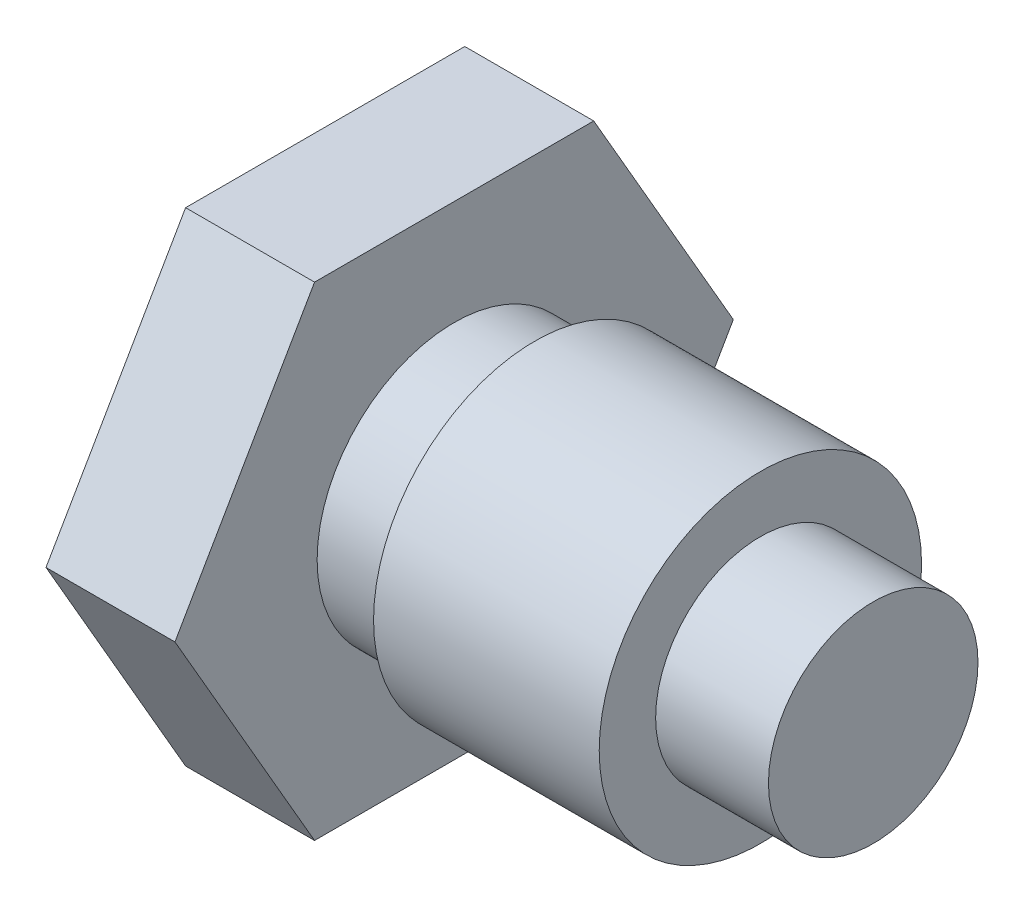
ISO-10303-21;
HEADER;
FILE_DESCRIPTION(('STEP AP214'),'2;1');
FILE_NAME('part.step','',(''),(''),'','','');
FILE_SCHEMA(('AUTOMOTIVE_DESIGN { 1 0 10303 214 1 1 1 1 }'));
ENDSEC;
DATA;
#1=APPLICATION_CONTEXT('core data for automotive mechanical design processes');
#2=APPLICATION_PROTOCOL_DEFINITION('international standard','automotive_design',2000,#1);
#3=PRODUCT_CONTEXT('',#1,'mechanical');
#4=PRODUCT('Part','Part','',(#3));
#5=PRODUCT_RELATED_PRODUCT_CATEGORY('part','',(#4));
#6=PRODUCT_DEFINITION_FORMATION('','',#4);
#7=PRODUCT_DEFINITION_CONTEXT('part definition',#1,'design');
#8=PRODUCT_DEFINITION('design','',#6,#7);
#9=PRODUCT_DEFINITION_SHAPE('','',#8);
#10=(LENGTH_UNIT() NAMED_UNIT(*) SI_UNIT(.MILLI.,.METRE.));
#11=(NAMED_UNIT(*) PLANE_ANGLE_UNIT() SI_UNIT($,.RADIAN.));
#12=(NAMED_UNIT(*) SI_UNIT($,.STERADIAN.) SOLID_ANGLE_UNIT());
#13=UNCERTAINTY_MEASURE_WITH_UNIT(LENGTH_MEASURE(1.E-05),#10,'distance_accuracy_value','');
#14=(GEOMETRIC_REPRESENTATION_CONTEXT(3) GLOBAL_UNCERTAINTY_ASSIGNED_CONTEXT((#13)) GLOBAL_UNIT_ASSIGNED_CONTEXT((#10,
#11,#12)) REPRESENTATION_CONTEXT('',''));
#15=CARTESIAN_POINT('',(0.,0.,0.));
#16=DIRECTION('',(0.,0.,1.));
#17=DIRECTION('',(1.,0.,0.));
#18=AXIS2_PLACEMENT_3D('',#15,#16,#17);
#19=CARTESIAN_POINT('',(8.,-14.9999930062483,-8.66025000000017));
#20=DIRECTION('',(0.,0.499999999999995,0.866025403784441));
#21=DIRECTION('',(0.,-0.866025403784442,0.499999999999995));
#22=AXIS2_PLACEMENT_3D('',#19,#20,#21);
#23=PLANE('',#22);
#24=DIRECTION('',(0.,0.866025403784441,-0.499999999999995));
#25=VECTOR('',#24,1.);
#26=CARTESIAN_POINT('',(0.,-14.9999930062483,-8.66025000000017));
#27=LINE('',#26,#25);
#28=CARTESIAN_POINT('',(0.,-14.9999930062483,-8.66025000000017));
#29=VERTEX_POINT('',#28);
#30=CARTESIAN_POINT('',(0.,0.,-17.3205));
#31=VERTEX_POINT('',#30);
#32=EDGE_CURVE('E123',#29,#31,#27,.T.);
#33=ORIENTED_EDGE('',*,*,#32,.T.);
#34=DIRECTION('',(-1.,0.,0.));
#35=VECTOR('',#34,1.);
#36=CARTESIAN_POINT('',(8.,0.,-17.3205));
#37=LINE('',#36,#35);
#38=CARTESIAN_POINT('',(8.,0.,-17.3205));
#39=VERTEX_POINT('',#38);
#40=EDGE_CURVE('E11',#39,#31,#37,.T.);
#41=ORIENTED_EDGE('',*,*,#40,.F.);
#42=DIRECTION('',(0.,0.866025403784441,-0.499999999999995));
#43=VECTOR('',#42,1.);
#44=CARTESIAN_POINT('',(8.,-14.9999930062483,-8.66025000000017));
#45=LINE('',#44,#43);
#46=CARTESIAN_POINT('',(8.,-14.9999930062483,-8.66025000000017));
#47=VERTEX_POINT('',#46);
#48=EDGE_CURVE('E134',#47,#39,#45,.T.);
#49=ORIENTED_EDGE('',*,*,#48,.F.);
#50=DIRECTION('',(-1.,0.,0.));
#51=VECTOR('',#50,1.);
#52=CARTESIAN_POINT('',(8.,-14.9999930062483,-8.66025000000017));
#53=LINE('',#52,#51);
#54=EDGE_CURVE('E119',#47,#29,#53,.T.);
#55=ORIENTED_EDGE('',*,*,#54,.T.);
#56=EDGE_LOOP('',(#33,#41,#49,#55));
#57=FACE_BOUND('',#56,.T.);
#58=ADVANCED_FACE('F39',(#57),#23,.F.);
#59=CARTESIAN_POINT('',(8.,0.,-17.3205));
#60=DIRECTION('',(0.,-0.500000000000001,0.866025403784438));
#61=DIRECTION('',(0.,-0.866025403784438,-0.500000000000001));
#62=AXIS2_PLACEMENT_3D('',#59,#60,#61);
#63=PLANE('',#62);
#64=DIRECTION('',(0.,0.866025403784438,0.500000000000001));
#65=VECTOR('',#64,1.);
#66=CARTESIAN_POINT('',(0.,0.,-17.3205));
#67=LINE('',#66,#65);
#68=CARTESIAN_POINT('',(0.,14.9999930062484,-8.66024999999996));
#69=VERTEX_POINT('',#68);
#70=EDGE_CURVE('E126',#31,#69,#67,.T.);
#71=ORIENTED_EDGE('',*,*,#70,.T.);
#72=DIRECTION('',(-1.,0.,0.));
#73=VECTOR('',#72,1.);
#74=CARTESIAN_POINT('',(8.,14.9999930062484,-8.66024999999996));
#75=LINE('',#74,#73);
#76=CARTESIAN_POINT('',(8.,14.9999930062484,-8.66024999999996));
#77=VERTEX_POINT('',#76);
#78=EDGE_CURVE('E47',#77,#69,#75,.T.);
#79=ORIENTED_EDGE('',*,*,#78,.F.);
#80=DIRECTION('',(0.,0.866025403784438,0.500000000000001));
#81=VECTOR('',#80,1.);
#82=CARTESIAN_POINT('',(8.,0.,-17.3205));
#83=LINE('',#82,#81);
#84=EDGE_CURVE('E92',#39,#77,#83,.T.);
#85=ORIENTED_EDGE('',*,*,#84,.F.);
#86=ORIENTED_EDGE('',*,*,#40,.T.);
#87=EDGE_LOOP('',(#71,#79,#85,#86));
#88=FACE_BOUND('',#87,.T.);
#89=ADVANCED_FACE('F159',(#88),#63,.F.);
#90=CARTESIAN_POINT('',(8.,14.9999930062484,-8.66024999999996));
#91=DIRECTION('',(0.,-1.,0.));
#92=DIRECTION('',(0.,0.,-1.));
#93=AXIS2_PLACEMENT_3D('',#90,#91,#92);
#94=PLANE('',#93);
#95=DIRECTION('',(0.,0.,1.));
#96=VECTOR('',#95,1.);
#97=CARTESIAN_POINT('',(0.,14.9999930062484,-8.66024999999996));
#98=LINE('',#97,#96);
#99=CARTESIAN_POINT('',(0.,14.9999930062483,8.66025000000007));
#100=VERTEX_POINT('',#99);
#101=EDGE_CURVE('E129',#69,#100,#98,.T.);
#102=ORIENTED_EDGE('',*,*,#101,.T.);
#103=DIRECTION('',(-1.,0.,0.));
#104=VECTOR('',#103,1.);
#105=CARTESIAN_POINT('',(8.,14.9999930062483,8.66025000000007));
#106=LINE('',#105,#104);
#107=CARTESIAN_POINT('',(8.,14.9999930062483,8.66025000000007));
#108=VERTEX_POINT('',#107);
#109=EDGE_CURVE('E114',#108,#100,#106,.T.);
#110=ORIENTED_EDGE('',*,*,#109,.F.);
#111=DIRECTION('',(0.,0.,1.));
#112=VECTOR('',#111,1.);
#113=CARTESIAN_POINT('',(8.,14.9999930062484,-8.66024999999996));
#114=LINE('',#113,#112);
#115=EDGE_CURVE('E105',#77,#108,#114,.T.);
#116=ORIENTED_EDGE('',*,*,#115,.F.);
#117=ORIENTED_EDGE('',*,*,#78,.T.);
#118=EDGE_LOOP('',(#102,#110,#116,#117));
#119=FACE_BOUND('',#118,.T.);
#120=ADVANCED_FACE('F140',(#119),#94,.F.);
#121=CARTESIAN_POINT('',(8.,14.9999930062483,8.66025000000007));
#122=DIRECTION('',(0.,-0.499999999999995,-0.866025403784442));
#123=DIRECTION('',(0.,0.866025403784442,-0.499999999999995));
#124=AXIS2_PLACEMENT_3D('',#121,#122,#123);
#125=PLANE('',#124);
#126=DIRECTION('',(0.,-0.866025403784442,0.499999999999995));
#127=VECTOR('',#126,1.);
#128=CARTESIAN_POINT('',(0.,14.9999930062483,8.66025000000007));
#129=LINE('',#128,#127);
#130=CARTESIAN_POINT('',(0.,-1.20948405058865E-13,17.3205));
#131=VERTEX_POINT('',#130);
#132=EDGE_CURVE('E113',#100,#131,#129,.T.);
#133=ORIENTED_EDGE('',*,*,#132,.T.);
#134=DIRECTION('',(-1.,0.,0.));
#135=VECTOR('',#134,1.);
#136=CARTESIAN_POINT('',(8.,-1.20948405058865E-13,17.3205));
#137=LINE('',#136,#135);
#138=CARTESIAN_POINT('',(8.,-1.20948405058865E-13,17.3205));
#139=VERTEX_POINT('',#138);
#140=EDGE_CURVE('E110',#139,#131,#137,.T.);
#141=ORIENTED_EDGE('',*,*,#140,.F.);
#142=DIRECTION('',(0.,-0.866025403784442,0.499999999999995));
#143=VECTOR('',#142,1.);
#144=CARTESIAN_POINT('',(8.,14.9999930062483,8.66025000000007));
#145=LINE('',#144,#143);
#146=EDGE_CURVE('E99',#108,#139,#145,.T.);
#147=ORIENTED_EDGE('',*,*,#146,.F.);
#148=ORIENTED_EDGE('',*,*,#109,.T.);
#149=EDGE_LOOP('',(#133,#141,#147,#148));
#150=FACE_BOUND('',#149,.T.);
#151=ADVANCED_FACE('F111',(#150),#125,.F.);
#152=CARTESIAN_POINT('',(8.,-1.20948405058865E-13,17.3205));
#153=DIRECTION('',(0.,0.500000000000007,-0.866025403784435));
#154=DIRECTION('',(0.,0.866025403784434,0.500000000000007));
#155=AXIS2_PLACEMENT_3D('',#152,#153,#154);
#156=PLANE('',#155);
#157=DIRECTION('',(0.,-0.866025403784435,-0.500000000000007));
#158=VECTOR('',#157,1.);
#159=CARTESIAN_POINT('',(0.,-1.20948405058865E-13,17.3205));
#160=LINE('',#159,#158);
#161=CARTESIAN_POINT('',(0.,-14.9999930062484,8.66024999999986));
#162=VERTEX_POINT('',#161);
#163=EDGE_CURVE('E78',#131,#162,#160,.T.);
#164=ORIENTED_EDGE('',*,*,#163,.T.);
#165=DIRECTION('',(-1.,0.,0.));
#166=VECTOR('',#165,1.);
#167=CARTESIAN_POINT('',(8.,-14.9999930062484,8.66024999999986));
#168=LINE('',#167,#166);
#169=CARTESIAN_POINT('',(8.,-14.9999930062484,8.66024999999986));
#170=VERTEX_POINT('',#169);
#171=EDGE_CURVE('E115',#170,#162,#168,.T.);
#172=ORIENTED_EDGE('',*,*,#171,.F.);
#173=DIRECTION('',(0.,-0.866025403784435,-0.500000000000007));
#174=VECTOR('',#173,1.);
#175=CARTESIAN_POINT('',(8.,-1.20948405058865E-13,17.3205));
#176=LINE('',#175,#174);
#177=EDGE_CURVE('E103',#139,#170,#176,.T.);
#178=ORIENTED_EDGE('',*,*,#177,.F.);
#179=ORIENTED_EDGE('',*,*,#140,.T.);
#180=EDGE_LOOP('',(#164,#172,#178,#179));
#181=FACE_BOUND('',#180,.T.);
#182=ADVANCED_FACE('F117',(#181),#156,.F.);
#183=CARTESIAN_POINT('',(8.,-14.9999930062484,8.66024999999986));
#184=DIRECTION('',(0.,1.,0.));
#185=DIRECTION('',(0.,0.,1.));
#186=AXIS2_PLACEMENT_3D('',#183,#184,#185);
#187=PLANE('',#186);
#188=DIRECTION('',(0.,0.,-1.));
#189=VECTOR('',#188,1.);
#190=CARTESIAN_POINT('',(0.,-14.9999930062484,8.66024999999986));
#191=LINE('',#190,#189);
#192=EDGE_CURVE('E84',#162,#29,#191,.T.);
#193=ORIENTED_EDGE('',*,*,#192,.T.);
#194=ORIENTED_EDGE('',*,*,#54,.F.);
#195=DIRECTION('',(0.,0.,-1.));
#196=VECTOR('',#195,1.);
#197=CARTESIAN_POINT('',(8.,-14.9999930062484,8.66024999999986));
#198=LINE('',#197,#196);
#199=EDGE_CURVE('E55',#170,#47,#198,.T.);
#200=ORIENTED_EDGE('',*,*,#199,.F.);
#201=ORIENTED_EDGE('',*,*,#171,.T.);
#202=EDGE_LOOP('',(#193,#194,#200,#201));
#203=FACE_BOUND('',#202,.T.);
#204=ADVANCED_FACE('F147',(#203),#187,.F.);
#205=CARTESIAN_POINT('',(8.,0.,0.));
#206=DIRECTION('',(1.,0.,0.));
#207=DIRECTION('',(0.,0.,-1.));
#208=AXIS2_PLACEMENT_3D('',#205,#206,#207);
#209=PLANE('',#208);
#210=CARTESIAN_POINT('',(8.,0.,0.));
#211=DIRECTION('',(-1.,0.,0.));
#212=DIRECTION('',(0.,0.,1.));
#213=AXIS2_PLACEMENT_3D('',#210,#211,#212);
#214=CIRCLE('',#213,8.5);
#215=CARTESIAN_POINT('',(8.,0.,8.5));
#216=VERTEX_POINT('',#215);
#217=EDGE_CURVE('E127',#216,#216,#214,.T.);
#218=ORIENTED_EDGE('',*,*,#217,.T.);
#219=EDGE_LOOP('',(#218));
#220=FACE_BOUND('',#219,.T.);
#221=ORIENTED_EDGE('',*,*,#48,.T.);
#222=ORIENTED_EDGE('',*,*,#84,.T.);
#223=ORIENTED_EDGE('',*,*,#115,.T.);
#224=ORIENTED_EDGE('',*,*,#146,.T.);
#225=ORIENTED_EDGE('',*,*,#177,.T.);
#226=ORIENTED_EDGE('',*,*,#199,.T.);
#227=EDGE_LOOP('',(#221,#222,#223,#224,#225,#226));
#228=FACE_BOUND('',#227,.T.);
#229=ADVANCED_FACE('F101',(#220,#228),#209,.T.);
#230=CARTESIAN_POINT('',(0.,0.,0.));
#231=DIRECTION('',(1.,0.,0.));
#232=DIRECTION('',(0.,0.,-1.));
#233=AXIS2_PLACEMENT_3D('',#230,#231,#232);
#234=PLANE('',#233);
#235=ORIENTED_EDGE('',*,*,#32,.F.);
#236=ORIENTED_EDGE('',*,*,#192,.F.);
#237=ORIENTED_EDGE('',*,*,#163,.F.);
#238=ORIENTED_EDGE('',*,*,#132,.F.);
#239=ORIENTED_EDGE('',*,*,#101,.F.);
#240=ORIENTED_EDGE('',*,*,#70,.F.);
#241=EDGE_LOOP('',(#235,#236,#237,#238,#239,#240));
#242=FACE_BOUND('',#241,.T.);
#243=ADVANCED_FACE('F143',(#242),#234,.F.);
#244=CARTESIAN_POINT('',(3.,0.,0.));
#245=DIRECTION('',(-1.,0.,0.));
#246=DIRECTION('',(0.,0.,1.));
#247=AXIS2_PLACEMENT_3D('',#244,#245,#246);
#248=CYLINDRICAL_SURFACE('',#247,8.5);
#249=ORIENTED_EDGE('',*,*,#217,.F.);
#250=EDGE_LOOP('',(#249));
#251=FACE_BOUND('',#250,.T.);
#252=CARTESIAN_POINT('',(13.,0.,0.));
#253=DIRECTION('',(-1.,0.,0.));
#254=DIRECTION('',(0.,0.,1.));
#255=AXIS2_PLACEMENT_3D('',#252,#253,#254);
#256=CIRCLE('',#255,8.5);
#257=CARTESIAN_POINT('',(13.,0.,8.5));
#258=VERTEX_POINT('',#257);
#259=EDGE_CURVE('E315',#258,#258,#256,.T.);
#260=ORIENTED_EDGE('',*,*,#259,.T.);
#261=EDGE_LOOP('',(#260));
#262=FACE_BOUND('',#261,.T.);
#263=ADVANCED_FACE('F193',(#251,#262),#248,.T.);
#264=CARTESIAN_POINT('',(13.,8.5,0.));
#265=DIRECTION('',(1.,0.,0.));
#266=DIRECTION('',(0.,0.,-1.));
#267=AXIS2_PLACEMENT_3D('',#264,#265,#266);
#268=PLANE('',#267);
#269=ORIENTED_EDGE('',*,*,#259,.F.);
#270=EDGE_LOOP('',(#269));
#271=FACE_BOUND('',#270,.T.);
#272=CARTESIAN_POINT('',(13.,0.,0.));
#273=DIRECTION('',(-1.,0.,0.));
#274=DIRECTION('',(0.,0.,1.));
#275=AXIS2_PLACEMENT_3D('',#272,#273,#274);
#276=CIRCLE('',#275,10.);
#277=CARTESIAN_POINT('',(13.,0.,10.));
#278=VERTEX_POINT('',#277);
#279=EDGE_CURVE('E312',#278,#278,#276,.T.);
#280=ORIENTED_EDGE('',*,*,#279,.T.);
#281=EDGE_LOOP('',(#280));
#282=FACE_BOUND('',#281,.T.);
#283=ADVANCED_FACE('F208',(#271,#282),#268,.F.);
#284=CARTESIAN_POINT('',(3.,0.,0.));
#285=DIRECTION('',(-1.,0.,0.));
#286=DIRECTION('',(0.,0.,1.));
#287=AXIS2_PLACEMENT_3D('',#284,#285,#286);
#288=CYLINDRICAL_SURFACE('',#287,10.);
#289=ORIENTED_EDGE('',*,*,#279,.F.);
#290=EDGE_LOOP('',(#289));
#291=FACE_BOUND('',#290,.T.);
#292=CARTESIAN_POINT('',(27.,0.,0.));
#293=DIRECTION('',(-1.,0.,0.));
#294=DIRECTION('',(0.,0.,1.));
#295=AXIS2_PLACEMENT_3D('',#292,#293,#294);
#296=CIRCLE('',#295,10.);
#297=CARTESIAN_POINT('',(27.,0.,10.));
#298=VERTEX_POINT('',#297);
#299=EDGE_CURVE('E307',#298,#298,#296,.T.);
#300=ORIENTED_EDGE('',*,*,#299,.T.);
#301=EDGE_LOOP('',(#300));
#302=FACE_BOUND('',#301,.T.);
#303=ADVANCED_FACE('F219',(#291,#302),#288,.T.);
#304=CARTESIAN_POINT('',(27.,10.,0.));
#305=DIRECTION('',(-1.,0.,0.));
#306=DIRECTION('',(0.,0.,1.));
#307=AXIS2_PLACEMENT_3D('',#304,#305,#306);
#308=PLANE('',#307);
#309=ORIENTED_EDGE('',*,*,#299,.F.);
#310=EDGE_LOOP('',(#309));
#311=FACE_BOUND('',#310,.T.);
#312=CARTESIAN_POINT('',(27.,0.,0.));
#313=DIRECTION('',(-1.,0.,0.));
#314=DIRECTION('',(0.,0.,1.));
#315=AXIS2_PLACEMENT_3D('',#312,#313,#314);
#316=CIRCLE('',#315,6.5);
#317=CARTESIAN_POINT('',(27.,0.,6.5));
#318=VERTEX_POINT('',#317);
#319=EDGE_CURVE('E304',#318,#318,#316,.T.);
#320=ORIENTED_EDGE('',*,*,#319,.T.);
#321=EDGE_LOOP('',(#320));
#322=FACE_BOUND('',#321,.T.);
#323=ADVANCED_FACE('F230',(#311,#322),#308,.F.);
#324=CARTESIAN_POINT('',(3.,0.,0.));
#325=DIRECTION('',(-1.,0.,0.));
#326=DIRECTION('',(0.,0.,1.));
#327=AXIS2_PLACEMENT_3D('',#324,#325,#326);
#328=CYLINDRICAL_SURFACE('',#327,6.5);
#329=ORIENTED_EDGE('',*,*,#319,.F.);
#330=EDGE_LOOP('',(#329));
#331=FACE_BOUND('',#330,.T.);
#332=CARTESIAN_POINT('',(34.,0.,0.));
#333=DIRECTION('',(-1.,0.,0.));
#334=DIRECTION('',(0.,0.,1.));
#335=AXIS2_PLACEMENT_3D('',#332,#333,#334);
#336=CIRCLE('',#335,6.5);
#337=CARTESIAN_POINT('',(34.,0.,6.5));
#338=VERTEX_POINT('',#337);
#339=EDGE_CURVE('E302',#338,#338,#336,.T.);
#340=ORIENTED_EDGE('',*,*,#339,.T.);
#341=EDGE_LOOP('',(#340));
#342=FACE_BOUND('',#341,.T.);
#343=ADVANCED_FACE('F241',(#331,#342),#328,.T.);
#344=CARTESIAN_POINT('',(34.,6.5,0.));
#345=DIRECTION('',(-1.,0.,0.));
#346=DIRECTION('',(0.,0.,1.));
#347=AXIS2_PLACEMENT_3D('',#344,#345,#346);
#348=PLANE('',#347);
#349=ORIENTED_EDGE('',*,*,#339,.F.);
#350=EDGE_LOOP('',(#349));
#351=FACE_BOUND('',#350,.T.);
#352=ADVANCED_FACE('F252',(#351),#348,.F.);
#353=CLOSED_SHELL('',(#58,#89,#120,#151,#182,#204,#229,#243,#263,#283,#303,#323,#343,#352));
#354=MANIFOLD_SOLID_BREP('B2',#353);
#355=ADVANCED_BREP_SHAPE_REPRESENTATION('',(#18,#354),#14);
#356=SHAPE_DEFINITION_REPRESENTATION(#9,#355);
ENDSEC;
END-ISO-10303-21;
